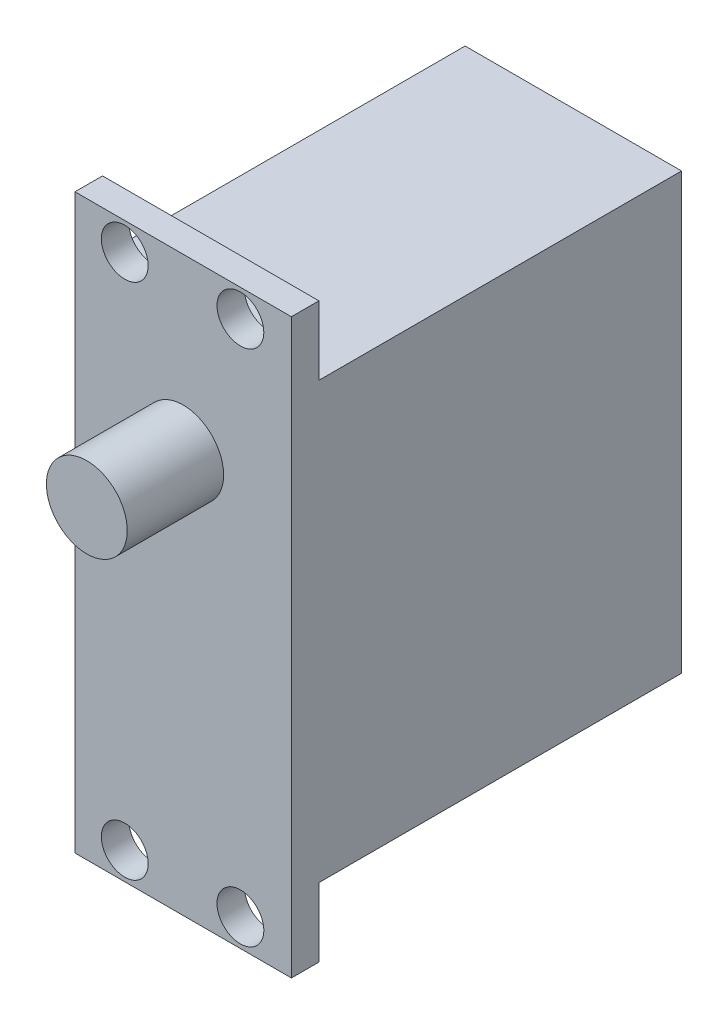
ISO-10303-21;
HEADER;
FILE_DESCRIPTION(('STEP AP214'),'2;1');
FILE_NAME('part.step','',(''),(''),'','','');
FILE_SCHEMA(('AUTOMOTIVE_DESIGN { 1 0 10303 214 1 1 1 1 }'));
ENDSEC;
DATA;
#1=APPLICATION_CONTEXT('core data for automotive mechanical design processes');
#2=APPLICATION_PROTOCOL_DEFINITION('international standard','automotive_design',2000,#1);
#3=PRODUCT_CONTEXT('',#1,'mechanical');
#4=PRODUCT('Part','Part','',(#3));
#5=PRODUCT_RELATED_PRODUCT_CATEGORY('part','',(#4));
#6=PRODUCT_DEFINITION_FORMATION('','',#4);
#7=PRODUCT_DEFINITION_CONTEXT('part definition',#1,'design');
#8=PRODUCT_DEFINITION('design','',#6,#7);
#9=PRODUCT_DEFINITION_SHAPE('','',#8);
#10=(LENGTH_UNIT() NAMED_UNIT(*) SI_UNIT(.MILLI.,.METRE.));
#11=(NAMED_UNIT(*) PLANE_ANGLE_UNIT() SI_UNIT($,.RADIAN.));
#12=(NAMED_UNIT(*) SI_UNIT($,.STERADIAN.) SOLID_ANGLE_UNIT());
#13=UNCERTAINTY_MEASURE_WITH_UNIT(LENGTH_MEASURE(1.E-05),#10,'distance_accuracy_value','');
#14=(GEOMETRIC_REPRESENTATION_CONTEXT(3) GLOBAL_UNCERTAINTY_ASSIGNED_CONTEXT((#13)) GLOBAL_UNIT_ASSIGNED_CONTEXT((#10,
#11,#12)) REPRESENTATION_CONTEXT('',''));
#15=CARTESIAN_POINT('',(0.,0.,0.));
#16=DIRECTION('',(0.,0.,1.));
#17=DIRECTION('',(1.,0.,0.));
#18=AXIS2_PLACEMENT_3D('',#15,#16,#17);
#19=CARTESIAN_POINT('',(0.,27.5788832916379,63.8063432179268));
#20=DIRECTION('',(0.,0.,-1.));
#21=DIRECTION('',(-1.,0.,0.));
#22=AXIS2_PLACEMENT_3D('',#19,#20,#21);
#23=CYLINDRICAL_SURFACE('',#22,3.73047673079755);
#24=CARTESIAN_POINT('',(0.,27.5788832916379,63.8063432179268));
#25=DIRECTION('',(0.,0.,1.));
#26=DIRECTION('',(1.,0.,0.));
#27=AXIS2_PLACEMENT_3D('',#24,#25,#26);
#28=CIRCLE('',#27,3.73047673079755);
#29=CARTESIAN_POINT('',(3.73047673079755,27.5788832916379,63.8063432179268));
#30=VERTEX_POINT('',#29);
#31=EDGE_CURVE('E11',#30,#30,#28,.T.);
#32=ORIENTED_EDGE('',*,*,#31,.F.);
#33=EDGE_LOOP('',(#32));
#34=FACE_BOUND('',#33,.T.);
#35=CARTESIAN_POINT('',(0.,27.5788832916379,54.9163432179269));
#36=DIRECTION('',(0.,0.,1.));
#37=DIRECTION('',(1.,0.,0.));
#38=AXIS2_PLACEMENT_3D('',#35,#36,#37);
#39=CIRCLE('',#38,3.73047673079755);
#40=CARTESIAN_POINT('',(3.73047673079755,27.5788832916379,54.9163432179269));
#41=VERTEX_POINT('',#40);
#42=EDGE_CURVE('E44',#41,#41,#39,.T.);
#43=ORIENTED_EDGE('',*,*,#42,.T.);
#44=EDGE_LOOP('',(#43));
#45=FACE_BOUND('',#44,.T.);
#46=ADVANCED_FACE('F41',(#34,#45),#23,.T.);
#47=CARTESIAN_POINT('',(0.,27.5788832916379,63.8063432179268));
#48=DIRECTION('',(0.,0.,1.));
#49=DIRECTION('',(1.,0.,0.));
#50=AXIS2_PLACEMENT_3D('',#47,#48,#49);
#51=PLANE('',#50);
#52=ORIENTED_EDGE('',*,*,#31,.T.);
#53=EDGE_LOOP('',(#52));
#54=FACE_BOUND('',#53,.T.);
#55=ADVANCED_FACE('F56',(#54),#51,.T.);
#56=CARTESIAN_POINT('',(0.,27.5788832916379,54.9163432179269));
#57=DIRECTION('',(0.,0.,1.));
#58=DIRECTION('',(1.,0.,0.));
#59=AXIS2_PLACEMENT_3D('',#56,#57,#58);
#60=PLANE('',#59);
#61=ORIENTED_EDGE('',*,*,#42,.F.);
#62=EDGE_LOOP('',(#61));
#63=FACE_BOUND('',#62,.T.);
#64=ADVANCED_FACE('F54',(#63),#60,.F.);
#65=CLOSED_SHELL('',(#46,#55,#64));
#66=MANIFOLD_SOLID_BREP('B2',#65);
#67=CARTESIAN_POINT('',(9.9822,-3.12971670836207,54.9163432179269));
#68=DIRECTION('',(0.,1.,0.));
#69=DIRECTION('',(0.,0.,1.));
#70=AXIS2_PLACEMENT_3D('',#67,#68,#69);
#71=PLANE('',#70);
#72=DIRECTION('',(0.,0.,-1.));
#73=VECTOR('',#72,1.);
#74=CARTESIAN_POINT('',(9.9822,-3.12971670836207,54.9163432179269));
#75=LINE('',#74,#73);
#76=CARTESIAN_POINT('',(9.9822,-3.12971670836207,52.3763432179269));
#77=VERTEX_POINT('',#76);
#78=CARTESIAN_POINT('',(9.9822,-3.12971670836207,18.9245432179268));
#79=VERTEX_POINT('',#78);
#80=EDGE_CURVE('E179',#77,#79,#75,.T.);
#81=ORIENTED_EDGE('',*,*,#80,.F.);
#82=DIRECTION('',(-1.,0.,0.));
#83=VECTOR('',#82,1.);
#84=CARTESIAN_POINT('',(-9.9822,-3.12971670836207,52.3763432179269));
#85=LINE('',#84,#83);
#86=CARTESIAN_POINT('',(-9.9822,-3.12971670836207,52.3763432179269));
#87=VERTEX_POINT('',#86);
#88=EDGE_CURVE('E169',#77,#87,#85,.T.);
#89=ORIENTED_EDGE('',*,*,#88,.T.);
#90=DIRECTION('',(0.,0.,-1.));
#91=VECTOR('',#90,1.);
#92=CARTESIAN_POINT('',(-9.9822,-3.12971670836207,54.9163432179269));
#93=LINE('',#92,#91);
#94=CARTESIAN_POINT('',(-9.9822,-3.12971670836207,18.9245432179268));
#95=VERTEX_POINT('',#94);
#96=EDGE_CURVE('E168',#87,#95,#93,.T.);
#97=ORIENTED_EDGE('',*,*,#96,.T.);
#98=DIRECTION('',(-1.,0.,0.));
#99=VECTOR('',#98,1.);
#100=CARTESIAN_POINT('',(9.9822,-3.12971670836207,18.9245432179268));
#101=LINE('',#100,#99);
#102=EDGE_CURVE('E39',#79,#95,#101,.T.);
#103=ORIENTED_EDGE('',*,*,#102,.F.);
#104=EDGE_LOOP('',(#81,#89,#97,#103));
#105=FACE_BOUND('',#104,.T.);
#106=ADVANCED_FACE('F82',(#105),#71,.F.);
#107=CARTESIAN_POINT('',(9.9822,37.0022832916379,18.9245432179269));
#108=DIRECTION('',(0.,0.,1.));
#109=DIRECTION('',(0.,-1.,0.));
#110=AXIS2_PLACEMENT_3D('',#107,#108,#109);
#111=PLANE('',#110);
#112=DIRECTION('',(0.,1.,0.));
#113=VECTOR('',#112,1.);
#114=CARTESIAN_POINT('',(-9.9822,37.0022832916379,18.9245432179269));
#115=LINE('',#114,#113);
#116=CARTESIAN_POINT('',(-9.9822,37.0022832916379,18.9245432179269));
#117=VERTEX_POINT('',#116);
#118=EDGE_CURVE('E226',#95,#117,#115,.T.);
#119=ORIENTED_EDGE('',*,*,#118,.T.);
#120=DIRECTION('',(-1.,0.,0.));
#121=VECTOR('',#120,1.);
#122=CARTESIAN_POINT('',(9.9822,37.0022832916379,18.9245432179269));
#123=LINE('',#122,#121);
#124=CARTESIAN_POINT('',(9.9822,37.0022832916379,18.9245432179269));
#125=VERTEX_POINT('',#124);
#126=EDGE_CURVE('E90',#125,#117,#123,.T.);
#127=ORIENTED_EDGE('',*,*,#126,.F.);
#128=DIRECTION('',(0.,1.,0.));
#129=VECTOR('',#128,1.);
#130=CARTESIAN_POINT('',(9.9822,37.0022832916379,18.9245432179269));
#131=LINE('',#130,#129);
#132=EDGE_CURVE('E183',#79,#125,#131,.T.);
#133=ORIENTED_EDGE('',*,*,#132,.F.);
#134=ORIENTED_EDGE('',*,*,#102,.T.);
#135=EDGE_LOOP('',(#119,#127,#133,#134));
#136=FACE_BOUND('',#135,.T.);
#137=ADVANCED_FACE('F265',(#136),#111,.F.);
#138=CARTESIAN_POINT('',(9.9822,37.0022832916379,54.9163432179269));
#139=DIRECTION('',(0.,-1.,0.));
#140=DIRECTION('',(0.,0.,-1.));
#141=AXIS2_PLACEMENT_3D('',#138,#139,#140);
#142=PLANE('',#141);
#143=DIRECTION('',(0.,0.,1.));
#144=VECTOR('',#143,1.);
#145=CARTESIAN_POINT('',(-9.9822,37.0022832916379,54.9163432179269));
#146=LINE('',#145,#144);
#147=CARTESIAN_POINT('',(-9.9822,37.0022832916379,52.3763432179269));
#148=VERTEX_POINT('',#147);
#149=EDGE_CURVE('E187',#117,#148,#146,.T.);
#150=ORIENTED_EDGE('',*,*,#149,.T.);
#151=DIRECTION('',(1.,0.,0.));
#152=VECTOR('',#151,1.);
#153=CARTESIAN_POINT('',(-9.9822,37.0022832916379,52.3763432179269));
#154=LINE('',#153,#152);
#155=CARTESIAN_POINT('',(9.9822,37.0022832916379,52.3763432179269));
#156=VERTEX_POINT('',#155);
#157=EDGE_CURVE('E206',#148,#156,#154,.T.);
#158=ORIENTED_EDGE('',*,*,#157,.T.);
#159=DIRECTION('',(0.,0.,1.));
#160=VECTOR('',#159,1.);
#161=CARTESIAN_POINT('',(9.9822,37.0022832916379,54.9163432179269));
#162=LINE('',#161,#160);
#163=EDGE_CURVE('E185',#125,#156,#162,.T.);
#164=ORIENTED_EDGE('',*,*,#163,.F.);
#165=ORIENTED_EDGE('',*,*,#126,.T.);
#166=EDGE_LOOP('',(#150,#158,#164,#165));
#167=FACE_BOUND('',#166,.T.);
#168=ADVANCED_FACE('F243',(#167),#142,.F.);
#169=CARTESIAN_POINT('',(9.9822,-3.12971670836207,54.9163432179269));
#170=DIRECTION('',(0.,0.,-1.));
#171=DIRECTION('',(-1.,0.,0.));
#172=AXIS2_PLACEMENT_3D('',#169,#170,#171);
#173=PLANE('',#172);
#174=DIRECTION('',(0.,-1.,0.));
#175=VECTOR('',#174,1.);
#176=CARTESIAN_POINT('',(-9.9822,-3.12971670836207,54.9163432179269));
#177=LINE('',#176,#175);
#178=CARTESIAN_POINT('',(-9.9822,43.3522832916379,54.9163432179269));
#179=VERTEX_POINT('',#178);
#180=CARTESIAN_POINT('',(-9.9822,-9.47971670836208,54.9163432179269));
#181=VERTEX_POINT('',#180);
#182=EDGE_CURVE('E184',#179,#181,#177,.T.);
#183=ORIENTED_EDGE('',*,*,#182,.T.);
#184=DIRECTION('',(1.,0.,0.));
#185=VECTOR('',#184,1.);
#186=CARTESIAN_POINT('',(-9.9822,-9.47971670836208,54.9163432179269));
#187=LINE('',#186,#185);
#188=CARTESIAN_POINT('',(9.9822,-9.47971670836208,54.9163432179269));
#189=VERTEX_POINT('',#188);
#190=EDGE_CURVE('E157',#181,#189,#187,.T.);
#191=ORIENTED_EDGE('',*,*,#190,.T.);
#192=DIRECTION('',(0.,-1.,0.));
#193=VECTOR('',#192,1.);
#194=CARTESIAN_POINT('',(9.9822,-3.12971670836207,54.9163432179269));
#195=LINE('',#194,#193);
#196=CARTESIAN_POINT('',(9.9822,43.3522832916379,54.9163432179269));
#197=VERTEX_POINT('',#196);
#198=EDGE_CURVE('E200',#197,#189,#195,.T.);
#199=ORIENTED_EDGE('',*,*,#198,.F.);
#200=DIRECTION('',(-1.,0.,0.));
#201=VECTOR('',#200,1.);
#202=CARTESIAN_POINT('',(-9.9822,43.3522832916379,54.9163432179269));
#203=LINE('',#202,#201);
#204=EDGE_CURVE('E219',#197,#179,#203,.T.);
#205=ORIENTED_EDGE('',*,*,#204,.T.);
#206=EDGE_LOOP('',(#183,#191,#199,#205));
#207=FACE_BOUND('',#206,.T.);
#208=CARTESIAN_POINT('',(-5.3899104724585,40.8217653477401,54.9163432179269));
#209=DIRECTION('',(0.,0.,1.));
#210=DIRECTION('',(1.,0.,0.));
#211=AXIS2_PLACEMENT_3D('',#208,#209,#210);
#212=CIRCLE('',#211,2.159);
#213=CARTESIAN_POINT('',(-3.2309104724585,40.8217653477401,54.9163432179269));
#214=VERTEX_POINT('',#213);
#215=EDGE_CURVE('E370',#214,#214,#212,.T.);
#216=ORIENTED_EDGE('',*,*,#215,.F.);
#217=EDGE_LOOP('',(#216));
#218=FACE_BOUND('',#217,.T.);
#219=CARTESIAN_POINT('',(5.2780895275415,40.8217653477401,54.9163432179269));
#220=DIRECTION('',(0.,0.,1.));
#221=DIRECTION('',(1.,0.,0.));
#222=AXIS2_PLACEMENT_3D('',#219,#220,#221);
#223=CIRCLE('',#222,2.159);
#224=CARTESIAN_POINT('',(7.4370895275415,40.8217653477401,54.9163432179269));
#225=VERTEX_POINT('',#224);
#226=EDGE_CURVE('E214',#225,#225,#223,.T.);
#227=ORIENTED_EDGE('',*,*,#226,.F.);
#228=EDGE_LOOP('',(#227));
#229=FACE_BOUND('',#228,.T.);
#230=CARTESIAN_POINT('',(5.2780895275415,-6.94919876446422,54.9163432179269));
#231=DIRECTION('',(0.,0.,1.));
#232=DIRECTION('',(-1.,0.,0.));
#233=AXIS2_PLACEMENT_3D('',#230,#231,#232);
#234=CIRCLE('',#233,2.159);
#235=CARTESIAN_POINT('',(3.1190895275415,-6.94919876446422,54.9163432179269));
#236=VERTEX_POINT('',#235);
#237=EDGE_CURVE('E357',#236,#236,#234,.T.);
#238=ORIENTED_EDGE('',*,*,#237,.F.);
#239=EDGE_LOOP('',(#238));
#240=FACE_BOUND('',#239,.T.);
#241=CARTESIAN_POINT('',(-5.3899104724585,-6.94919876446422,54.9163432179269));
#242=DIRECTION('',(0.,0.,1.));
#243=DIRECTION('',(-1.,0.,0.));
#244=AXIS2_PLACEMENT_3D('',#241,#242,#243);
#245=CIRCLE('',#244,2.159);
#246=CARTESIAN_POINT('',(-7.5489104724585,-6.94919876446422,54.9163432179269));
#247=VERTEX_POINT('',#246);
#248=EDGE_CURVE('E360',#247,#247,#245,.T.);
#249=ORIENTED_EDGE('',*,*,#248,.F.);
#250=EDGE_LOOP('',(#249));
#251=FACE_BOUND('',#250,.T.);
#252=ADVANCED_FACE('F230',(#207,#218,#229,#240,#251),#173,.F.);
#253=CARTESIAN_POINT('',(9.9822,-3.12971670836207,18.9245432179268));
#254=DIRECTION('',(-1.,0.,0.));
#255=DIRECTION('',(0.,0.,1.));
#256=AXIS2_PLACEMENT_3D('',#253,#254,#255);
#257=PLANE('',#256);
#258=ORIENTED_EDGE('',*,*,#198,.T.);
#259=DIRECTION('',(0.,0.,1.));
#260=VECTOR('',#259,1.);
#261=CARTESIAN_POINT('',(9.9822,-9.47971670836208,52.3763432179269));
#262=LINE('',#261,#260);
#263=CARTESIAN_POINT('',(9.9822,-9.47971670836208,52.3763432179269));
#264=VERTEX_POINT('',#263);
#265=EDGE_CURVE('E159',#264,#189,#262,.T.);
#266=ORIENTED_EDGE('',*,*,#265,.F.);
#267=DIRECTION('',(0.,1.,0.));
#268=VECTOR('',#267,1.);
#269=CARTESIAN_POINT('',(9.9822,-3.12971670836207,52.3763432179269));
#270=LINE('',#269,#268);
#271=EDGE_CURVE('E160',#264,#77,#270,.T.);
#272=ORIENTED_EDGE('',*,*,#271,.T.);
#273=ORIENTED_EDGE('',*,*,#80,.T.);
#274=ORIENTED_EDGE('',*,*,#132,.T.);
#275=ORIENTED_EDGE('',*,*,#163,.T.);
#276=DIRECTION('',(0.,1.,0.));
#277=VECTOR('',#276,1.);
#278=CARTESIAN_POINT('',(9.9822,37.0022832916379,52.3763432179269));
#279=LINE('',#278,#277);
#280=CARTESIAN_POINT('',(9.9822,43.3522832916379,52.3763432179269));
#281=VERTEX_POINT('',#280);
#282=EDGE_CURVE('E106',#156,#281,#279,.T.);
#283=ORIENTED_EDGE('',*,*,#282,.T.);
#284=DIRECTION('',(0.,0.,1.));
#285=VECTOR('',#284,1.);
#286=CARTESIAN_POINT('',(9.9822,43.3522832916379,52.3763432179269));
#287=LINE('',#286,#285);
#288=EDGE_CURVE('E195',#281,#197,#287,.T.);
#289=ORIENTED_EDGE('',*,*,#288,.T.);
#290=EDGE_LOOP('',(#258,#266,#272,#273,#274,#275,#283,#289));
#291=FACE_BOUND('',#290,.T.);
#292=ADVANCED_FACE('F178',(#291),#257,.F.);
#293=CARTESIAN_POINT('',(-9.9822,-3.12971670836207,18.9245432179268));
#294=DIRECTION('',(-1.,0.,0.));
#295=DIRECTION('',(0.,0.,1.));
#296=AXIS2_PLACEMENT_3D('',#293,#294,#295);
#297=PLANE('',#296);
#298=ORIENTED_EDGE('',*,*,#96,.F.);
#299=DIRECTION('',(0.,-1.,0.));
#300=VECTOR('',#299,1.);
#301=CARTESIAN_POINT('',(-9.9822,-3.12971670836207,52.3763432179269));
#302=LINE('',#301,#300);
#303=CARTESIAN_POINT('',(-9.9822,-9.47971670836208,52.3763432179269));
#304=VERTEX_POINT('',#303);
#305=EDGE_CURVE('E98',#87,#304,#302,.T.);
#306=ORIENTED_EDGE('',*,*,#305,.T.);
#307=DIRECTION('',(0.,0.,1.));
#308=VECTOR('',#307,1.);
#309=CARTESIAN_POINT('',(-9.9822,-9.47971670836208,52.3763432179269));
#310=LINE('',#309,#308);
#311=EDGE_CURVE('E151',#304,#181,#310,.T.);
#312=ORIENTED_EDGE('',*,*,#311,.T.);
#313=ORIENTED_EDGE('',*,*,#182,.F.);
#314=DIRECTION('',(0.,0.,1.));
#315=VECTOR('',#314,1.);
#316=CARTESIAN_POINT('',(-9.9822,43.3522832916379,52.3763432179269));
#317=LINE('',#316,#315);
#318=CARTESIAN_POINT('',(-9.9822,43.3522832916379,52.3763432179269));
#319=VERTEX_POINT('',#318);
#320=EDGE_CURVE('E222',#319,#179,#317,.T.);
#321=ORIENTED_EDGE('',*,*,#320,.F.);
#322=DIRECTION('',(0.,-1.,0.));
#323=VECTOR('',#322,1.);
#324=CARTESIAN_POINT('',(-9.9822,37.0022832916379,52.3763432179269));
#325=LINE('',#324,#323);
#326=EDGE_CURVE('E209',#319,#148,#325,.T.);
#327=ORIENTED_EDGE('',*,*,#326,.T.);
#328=ORIENTED_EDGE('',*,*,#149,.F.);
#329=ORIENTED_EDGE('',*,*,#118,.F.);
#330=EDGE_LOOP('',(#298,#306,#312,#313,#321,#327,#328,#329));
#331=FACE_BOUND('',#330,.T.);
#332=ADVANCED_FACE('F166',(#331),#297,.T.);
#333=CARTESIAN_POINT('',(-9.9822,43.3522832916379,52.3763432179269));
#334=DIRECTION('',(0.,1.,0.));
#335=DIRECTION('',(-1.,0.,0.));
#336=AXIS2_PLACEMENT_3D('',#333,#334,#335);
#337=PLANE('',#336);
#338=ORIENTED_EDGE('',*,*,#204,.F.);
#339=ORIENTED_EDGE('',*,*,#288,.F.);
#340=DIRECTION('',(-1.,0.,0.));
#341=VECTOR('',#340,1.);
#342=CARTESIAN_POINT('',(-9.9822,43.3522832916379,52.3763432179269));
#343=LINE('',#342,#341);
#344=EDGE_CURVE('E216',#281,#319,#343,.T.);
#345=ORIENTED_EDGE('',*,*,#344,.T.);
#346=ORIENTED_EDGE('',*,*,#320,.T.);
#347=EDGE_LOOP('',(#338,#339,#345,#346));
#348=FACE_BOUND('',#347,.T.);
#349=ADVANCED_FACE('F228',(#348),#337,.T.);
#350=CARTESIAN_POINT('',(-9.9822,43.3522832916379,52.3763432179269));
#351=DIRECTION('',(0.,0.,-1.));
#352=DIRECTION('',(-1.,0.,0.));
#353=AXIS2_PLACEMENT_3D('',#350,#351,#352);
#354=PLANE('',#353);
#355=CARTESIAN_POINT('',(-5.3899104724585,40.8217653477401,52.3763432179269));
#356=DIRECTION('',(0.,0.,1.));
#357=DIRECTION('',(1.,0.,0.));
#358=AXIS2_PLACEMENT_3D('',#355,#356,#357);
#359=CIRCLE('',#358,2.159);
#360=CARTESIAN_POINT('',(-3.2309104724585,40.8217653477401,52.3763432179269));
#361=VERTEX_POINT('',#360);
#362=EDGE_CURVE('E372',#361,#361,#359,.T.);
#363=ORIENTED_EDGE('',*,*,#362,.T.);
#364=EDGE_LOOP('',(#363));
#365=FACE_BOUND('',#364,.T.);
#366=CARTESIAN_POINT('',(5.2780895275415,40.8217653477401,52.3763432179269));
#367=DIRECTION('',(0.,0.,1.));
#368=DIRECTION('',(1.,0.,0.));
#369=AXIS2_PLACEMENT_3D('',#366,#367,#368);
#370=CIRCLE('',#369,2.159);
#371=CARTESIAN_POINT('',(7.4370895275415,40.8217653477401,52.3763432179269));
#372=VERTEX_POINT('',#371);
#373=EDGE_CURVE('E221',#372,#372,#370,.T.);
#374=ORIENTED_EDGE('',*,*,#373,.T.);
#375=EDGE_LOOP('',(#374));
#376=FACE_BOUND('',#375,.T.);
#377=ORIENTED_EDGE('',*,*,#326,.F.);
#378=ORIENTED_EDGE('',*,*,#344,.F.);
#379=ORIENTED_EDGE('',*,*,#282,.F.);
#380=ORIENTED_EDGE('',*,*,#157,.F.);
#381=EDGE_LOOP('',(#377,#378,#379,#380));
#382=FACE_BOUND('',#381,.T.);
#383=ADVANCED_FACE('F249',(#365,#376,#382),#354,.T.);
#384=CARTESIAN_POINT('',(5.2780895275415,40.8217653477401,52.3763432179269));
#385=DIRECTION('',(0.,0.,1.));
#386=DIRECTION('',(1.,0.,0.));
#387=AXIS2_PLACEMENT_3D('',#384,#385,#386);
#388=CYLINDRICAL_SURFACE('',#387,2.159);
#389=ORIENTED_EDGE('',*,*,#373,.F.);
#390=EDGE_LOOP('',(#389));
#391=FACE_BOUND('',#390,.T.);
#392=ORIENTED_EDGE('',*,*,#226,.T.);
#393=EDGE_LOOP('',(#392));
#394=FACE_BOUND('',#393,.T.);
#395=ADVANCED_FACE('F251',(#391,#394),#388,.F.);
#396=CARTESIAN_POINT('',(-5.3899104724585,40.8217653477401,52.3763432179269));
#397=DIRECTION('',(0.,0.,1.));
#398=DIRECTION('',(1.,0.,0.));
#399=AXIS2_PLACEMENT_3D('',#396,#397,#398);
#400=CYLINDRICAL_SURFACE('',#399,2.159);
#401=ORIENTED_EDGE('',*,*,#362,.F.);
#402=EDGE_LOOP('',(#401));
#403=FACE_BOUND('',#402,.T.);
#404=ORIENTED_EDGE('',*,*,#215,.T.);
#405=EDGE_LOOP('',(#404));
#406=FACE_BOUND('',#405,.T.);
#407=ADVANCED_FACE('F258',(#403,#406),#400,.F.);
#408=CARTESIAN_POINT('',(-9.9822,-9.47971670836208,52.3763432179269));
#409=DIRECTION('',(0.,-1.,0.));
#410=DIRECTION('',(1.,0.,0.));
#411=AXIS2_PLACEMENT_3D('',#408,#409,#410);
#412=PLANE('',#411);
#413=ORIENTED_EDGE('',*,*,#190,.F.);
#414=ORIENTED_EDGE('',*,*,#311,.F.);
#415=DIRECTION('',(1.,0.,0.));
#416=VECTOR('',#415,1.);
#417=CARTESIAN_POINT('',(-9.9822,-9.47971670836208,52.3763432179269));
#418=LINE('',#417,#416);
#419=EDGE_CURVE('E154',#304,#264,#418,.T.);
#420=ORIENTED_EDGE('',*,*,#419,.T.);
#421=ORIENTED_EDGE('',*,*,#265,.T.);
#422=EDGE_LOOP('',(#413,#414,#420,#421));
#423=FACE_BOUND('',#422,.T.);
#424=ADVANCED_FACE('F152',(#423),#412,.T.);
#425=CARTESIAN_POINT('',(9.9822,-3.12971670836207,52.3763432179269));
#426=DIRECTION('',(0.,0.,-1.));
#427=DIRECTION('',(-1.,0.,0.));
#428=AXIS2_PLACEMENT_3D('',#425,#426,#427);
#429=PLANE('',#428);
#430=CARTESIAN_POINT('',(5.2780895275415,-6.94919876446422,52.3763432179269));
#431=DIRECTION('',(0.,0.,1.));
#432=DIRECTION('',(-1.,0.,0.));
#433=AXIS2_PLACEMENT_3D('',#430,#431,#432);
#434=CIRCLE('',#433,2.159);
#435=CARTESIAN_POINT('',(3.1190895275415,-6.94919876446422,52.3763432179269));
#436=VERTEX_POINT('',#435);
#437=EDGE_CURVE('E354',#436,#436,#434,.T.);
#438=ORIENTED_EDGE('',*,*,#437,.T.);
#439=EDGE_LOOP('',(#438));
#440=FACE_BOUND('',#439,.T.);
#441=CARTESIAN_POINT('',(-5.3899104724585,-6.94919876446422,52.3763432179269));
#442=DIRECTION('',(0.,0.,1.));
#443=DIRECTION('',(-1.,0.,0.));
#444=AXIS2_PLACEMENT_3D('',#441,#442,#443);
#445=CIRCLE('',#444,2.159);
#446=CARTESIAN_POINT('',(-7.5489104724585,-6.94919876446422,52.3763432179269));
#447=VERTEX_POINT('',#446);
#448=EDGE_CURVE('E363',#447,#447,#445,.T.);
#449=ORIENTED_EDGE('',*,*,#448,.T.);
#450=EDGE_LOOP('',(#449));
#451=FACE_BOUND('',#450,.T.);
#452=ORIENTED_EDGE('',*,*,#88,.F.);
#453=ORIENTED_EDGE('',*,*,#271,.F.);
#454=ORIENTED_EDGE('',*,*,#419,.F.);
#455=ORIENTED_EDGE('',*,*,#305,.F.);
#456=EDGE_LOOP('',(#452,#453,#454,#455));
#457=FACE_BOUND('',#456,.T.);
#458=ADVANCED_FACE('F162',(#440,#451,#457),#429,.T.);
#459=CARTESIAN_POINT('',(-5.3899104724585,-6.94919876446422,52.3763432179269));
#460=DIRECTION('',(0.,0.,1.));
#461=DIRECTION('',(1.,0.,0.));
#462=AXIS2_PLACEMENT_3D('',#459,#460,#461);
#463=CYLINDRICAL_SURFACE('',#462,2.159);
#464=ORIENTED_EDGE('',*,*,#448,.F.);
#465=EDGE_LOOP('',(#464));
#466=FACE_BOUND('',#465,.T.);
#467=ORIENTED_EDGE('',*,*,#248,.T.);
#468=EDGE_LOOP('',(#467));
#469=FACE_BOUND('',#468,.T.);
#470=ADVANCED_FACE('F327',(#466,#469),#463,.F.);
#471=CARTESIAN_POINT('',(5.2780895275415,-6.94919876446422,52.3763432179269));
#472=DIRECTION('',(0.,0.,1.));
#473=DIRECTION('',(1.,0.,0.));
#474=AXIS2_PLACEMENT_3D('',#471,#472,#473);
#475=CYLINDRICAL_SURFACE('',#474,2.159);
#476=ORIENTED_EDGE('',*,*,#437,.F.);
#477=EDGE_LOOP('',(#476));
#478=FACE_BOUND('',#477,.T.);
#479=ORIENTED_EDGE('',*,*,#237,.T.);
#480=EDGE_LOOP('',(#479));
#481=FACE_BOUND('',#480,.T.);
#482=ADVANCED_FACE('F337',(#478,#481),#475,.F.);
#483=CLOSED_SHELL('',(#106,#137,#168,#252,#292,#332,#349,#383,#395,#407,#424,#458,#470,#482));
#484=MANIFOLD_SOLID_BREP('B6',#483);
#485=ADVANCED_BREP_SHAPE_REPRESENTATION('',(#18,#66,#484),#14);
#486=SHAPE_DEFINITION_REPRESENTATION(#9,#485);
ENDSEC;
END-ISO-10303-21;
